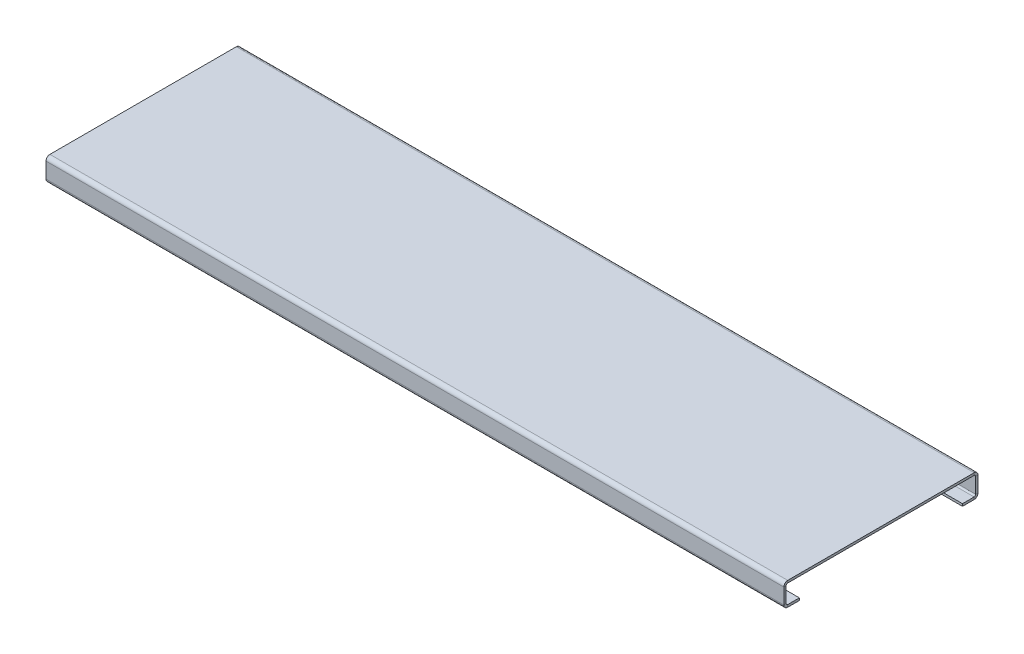
ISO-10303-21;
HEADER;
FILE_DESCRIPTION(('STEP AP214'),'2;1');
FILE_NAME('part.step','',(''),(''),'','','');
FILE_SCHEMA(('AUTOMOTIVE_DESIGN { 1 0 10303 214 1 1 1 1 }'));
ENDSEC;
DATA;
#1=APPLICATION_CONTEXT('core data for automotive mechanical design processes');
#2=APPLICATION_PROTOCOL_DEFINITION('international standard','automotive_design',2000,#1);
#3=PRODUCT_CONTEXT('',#1,'mechanical');
#4=PRODUCT('Part','Part','',(#3));
#5=PRODUCT_RELATED_PRODUCT_CATEGORY('part','',(#4));
#6=PRODUCT_DEFINITION_FORMATION('','',#4);
#7=PRODUCT_DEFINITION_CONTEXT('part definition',#1,'design');
#8=PRODUCT_DEFINITION('design','',#6,#7);
#9=PRODUCT_DEFINITION_SHAPE('','',#8);
#10=(LENGTH_UNIT() NAMED_UNIT(*) SI_UNIT(.MILLI.,.METRE.));
#11=(NAMED_UNIT(*) PLANE_ANGLE_UNIT() SI_UNIT($,.RADIAN.));
#12=(NAMED_UNIT(*) SI_UNIT($,.STERADIAN.) SOLID_ANGLE_UNIT());
#13=UNCERTAINTY_MEASURE_WITH_UNIT(LENGTH_MEASURE(1.E-05),#10,'distance_accuracy_value','');
#14=(GEOMETRIC_REPRESENTATION_CONTEXT(3) GLOBAL_UNCERTAINTY_ASSIGNED_CONTEXT((#13)) GLOBAL_UNIT_ASSIGNED_CONTEXT((#10,
#11,#12)) REPRESENTATION_CONTEXT('',''));
#15=CARTESIAN_POINT('',(0.,0.,0.));
#16=DIRECTION('',(0.,0.,1.));
#17=DIRECTION('',(1.,0.,0.));
#18=AXIS2_PLACEMENT_3D('',#15,#16,#17);
#19=CARTESIAN_POINT('',(950.,-25.,0.));
#20=DIRECTION('',(1.,0.,0.));
#21=DIRECTION('',(0.,0.,-1.));
#22=AXIS2_PLACEMENT_3D('',#19,#20,#21);
#23=PLANE('',#22);
#24=DIRECTION('',(0.,0.,-1.));
#25=VECTOR('',#24,1.);
#26=CARTESIAN_POINT('',(950.,-25.,0.));
#27=LINE('',#26,#25);
#28=CARTESIAN_POINT('',(950.,-25.,0.));
#29=VERTEX_POINT('',#28);
#30=CARTESIAN_POINT('',(950.,-25.,-3.));
#31=VERTEX_POINT('',#30);
#32=EDGE_CURVE('E11',#29,#31,#27,.T.);
#33=ORIENTED_EDGE('',*,*,#32,.F.);
#34=CARTESIAN_POINT('',(950.,-25.,-5.));
#35=DIRECTION('',(1.,0.,0.));
#36=DIRECTION('',(0.,0.,-1.));
#37=AXIS2_PLACEMENT_3D('',#34,#35,#36);
#38=CIRCLE('',#37,5.);
#39=CARTESIAN_POINT('',(950.,-30.,-5.));
#40=VERTEX_POINT('',#39);
#41=EDGE_CURVE('E364',#40,#29,#38,.F.);
#42=ORIENTED_EDGE('',*,*,#41,.F.);
#43=DIRECTION('',(0.,-1.,0.));
#44=VECTOR('',#43,1.);
#45=CARTESIAN_POINT('',(950.,-27.,-5.));
#46=LINE('',#45,#44);
#47=CARTESIAN_POINT('',(950.,-27.,-5.));
#48=VERTEX_POINT('',#47);
#49=EDGE_CURVE('E43',#48,#40,#46,.T.);
#50=ORIENTED_EDGE('',*,*,#49,.F.);
#51=CARTESIAN_POINT('',(950.,-25.,-5.));
#52=DIRECTION('',(1.,0.,0.));
#53=DIRECTION('',(0.,0.,-1.));
#54=AXIS2_PLACEMENT_3D('',#51,#52,#53);
#55=CIRCLE('',#54,2.);
#56=EDGE_CURVE('E377',#48,#31,#55,.F.);
#57=ORIENTED_EDGE('',*,*,#56,.T.);
#58=EDGE_LOOP('',(#33,#42,#50,#57));
#59=FACE_BOUND('',#58,.T.);
#60=ADVANCED_FACE('F35',(#59),#23,.T.);
#61=CARTESIAN_POINT('',(950.,-27.,-5.));
#62=DIRECTION('',(1.,0.,0.));
#63=DIRECTION('',(0.,0.,-1.));
#64=AXIS2_PLACEMENT_3D('',#61,#62,#63);
#65=PLANE('',#64);
#66=DIRECTION('',(0.,1.,0.));
#67=VECTOR('',#66,1.);
#68=CARTESIAN_POINT('',(950.,0.,0.));
#69=LINE('',#68,#67);
#70=CARTESIAN_POINT('',(950.,-5.,0.));
#71=VERTEX_POINT('',#70);
#72=EDGE_CURVE('E368',#29,#71,#69,.T.);
#73=ORIENTED_EDGE('',*,*,#72,.F.);
#74=ORIENTED_EDGE('',*,*,#32,.T.);
#75=DIRECTION('',(0.,1.,0.));
#76=VECTOR('',#75,1.);
#77=CARTESIAN_POINT('',(950.,0.,-3.));
#78=LINE('',#77,#76);
#79=CARTESIAN_POINT('',(950.,-5.,-3.));
#80=VERTEX_POINT('',#79);
#81=EDGE_CURVE('E379',#31,#80,#78,.T.);
#82=ORIENTED_EDGE('',*,*,#81,.T.);
#83=DIRECTION('',(0.,0.,1.));
#84=VECTOR('',#83,1.);
#85=CARTESIAN_POINT('',(950.,-5.,-3.));
#86=LINE('',#85,#84);
#87=EDGE_CURVE('E338',#80,#71,#86,.T.);
#88=ORIENTED_EDGE('',*,*,#87,.T.);
#89=EDGE_LOOP('',(#73,#74,#82,#88));
#90=FACE_BOUND('',#89,.T.);
#91=ADVANCED_FACE('F448',(#90),#65,.T.);
#92=CARTESIAN_POINT('',(0.,-30.,-5.));
#93=DIRECTION('',(-1.,0.,0.));
#94=DIRECTION('',(0.,0.,1.));
#95=AXIS2_PLACEMENT_3D('',#92,#93,#94);
#96=PLANE('',#95);
#97=DIRECTION('',(0.,1.,0.));
#98=VECTOR('',#97,1.);
#99=CARTESIAN_POINT('',(0.,-30.,-5.));
#100=LINE('',#99,#98);
#101=CARTESIAN_POINT('',(0.,-30.,-5.));
#102=VERTEX_POINT('',#101);
#103=CARTESIAN_POINT('',(0.,-27.,-5.));
#104=VERTEX_POINT('',#103);
#105=EDGE_CURVE('E344',#102,#104,#100,.T.);
#106=ORIENTED_EDGE('',*,*,#105,.F.);
#107=CARTESIAN_POINT('',(0.,-25.,-5.));
#108=DIRECTION('',(1.,0.,0.));
#109=DIRECTION('',(0.,0.,-1.));
#110=AXIS2_PLACEMENT_3D('',#107,#108,#109);
#111=CIRCLE('',#110,5.);
#112=CARTESIAN_POINT('',(0.,-25.,0.));
#113=VERTEX_POINT('',#112);
#114=EDGE_CURVE('E248',#102,#113,#111,.F.);
#115=ORIENTED_EDGE('',*,*,#114,.T.);
#116=DIRECTION('',(0.,0.,1.));
#117=VECTOR('',#116,1.);
#118=CARTESIAN_POINT('',(0.,-25.,-3.));
#119=LINE('',#118,#117);
#120=CARTESIAN_POINT('',(0.,-25.,-3.));
#121=VERTEX_POINT('',#120);
#122=EDGE_CURVE('E342',#121,#113,#119,.T.);
#123=ORIENTED_EDGE('',*,*,#122,.F.);
#124=CARTESIAN_POINT('',(0.,-25.,-5.));
#125=DIRECTION('',(1.,0.,0.));
#126=DIRECTION('',(0.,0.,-1.));
#127=AXIS2_PLACEMENT_3D('',#124,#125,#126);
#128=CIRCLE('',#127,2.);
#129=EDGE_CURVE('E260',#104,#121,#128,.F.);
#130=ORIENTED_EDGE('',*,*,#129,.F.);
#131=EDGE_LOOP('',(#106,#115,#123,#130));
#132=FACE_BOUND('',#131,.T.);
#133=ADVANCED_FACE('F490',(#132),#96,.T.);
#134=CARTESIAN_POINT('',(0.,-25.,-3.));
#135=DIRECTION('',(-1.,0.,0.));
#136=DIRECTION('',(0.,0.,1.));
#137=AXIS2_PLACEMENT_3D('',#134,#135,#136);
#138=PLANE('',#137);
#139=DIRECTION('',(0.,0.,1.));
#140=VECTOR('',#139,1.);
#141=CARTESIAN_POINT('',(0.,-30.,0.));
#142=LINE('',#141,#140);
#143=CARTESIAN_POINT('',(0.,-30.,-20.));
#144=VERTEX_POINT('',#143);
#145=EDGE_CURVE('E251',#144,#102,#142,.T.);
#146=ORIENTED_EDGE('',*,*,#145,.T.);
#147=ORIENTED_EDGE('',*,*,#105,.T.);
#148=DIRECTION('',(0.,0.,-1.));
#149=VECTOR('',#148,1.);
#150=CARTESIAN_POINT('',(0.,-27.,0.));
#151=LINE('',#150,#149);
#152=CARTESIAN_POINT('',(0.,-27.,-20.));
#153=VERTEX_POINT('',#152);
#154=EDGE_CURVE('E257',#153,#104,#151,.F.);
#155=ORIENTED_EDGE('',*,*,#154,.F.);
#156=DIRECTION('',(0.,-1.,0.));
#157=VECTOR('',#156,1.);
#158=CARTESIAN_POINT('',(0.,-27.,-20.));
#159=LINE('',#158,#157);
#160=EDGE_CURVE('E254',#153,#144,#159,.T.);
#161=ORIENTED_EDGE('',*,*,#160,.T.);
#162=EDGE_LOOP('',(#146,#147,#155,#161));
#163=FACE_BOUND('',#162,.T.);
#164=ADVANCED_FACE('F494',(#163),#138,.T.);
#165=CARTESIAN_POINT('',(950.,0.,-5.));
#166=DIRECTION('',(1.,0.,0.));
#167=DIRECTION('',(0.,0.,-1.));
#168=AXIS2_PLACEMENT_3D('',#165,#166,#167);
#169=PLANE('',#168);
#170=DIRECTION('',(0.,-1.,0.));
#171=VECTOR('',#170,1.);
#172=CARTESIAN_POINT('',(950.,0.,-5.));
#173=LINE('',#172,#171);
#174=CARTESIAN_POINT('',(950.,0.,-5.));
#175=VERTEX_POINT('',#174);
#176=CARTESIAN_POINT('',(950.,-3.,-5.));
#177=VERTEX_POINT('',#176);
#178=EDGE_CURVE('E340',#175,#177,#173,.T.);
#179=ORIENTED_EDGE('',*,*,#178,.F.);
#180=CARTESIAN_POINT('',(950.,-5.,-5.));
#181=DIRECTION('',(1.,0.,0.));
#182=DIRECTION('',(0.,0.,-1.));
#183=AXIS2_PLACEMENT_3D('',#180,#181,#182);
#184=CIRCLE('',#183,5.);
#185=EDGE_CURVE('E438',#71,#175,#184,.F.);
#186=ORIENTED_EDGE('',*,*,#185,.F.);
#187=ORIENTED_EDGE('',*,*,#87,.F.);
#188=CARTESIAN_POINT('',(950.,-5.,-5.));
#189=DIRECTION('',(1.,0.,0.));
#190=DIRECTION('',(0.,0.,-1.));
#191=AXIS2_PLACEMENT_3D('',#188,#189,#190);
#192=CIRCLE('',#191,2.);
#193=EDGE_CURVE('E382',#80,#177,#192,.F.);
#194=ORIENTED_EDGE('',*,*,#193,.T.);
#195=EDGE_LOOP('',(#179,#186,#187,#194));
#196=FACE_BOUND('',#195,.T.);
#197=ADVANCED_FACE('F455',(#196),#169,.T.);
#198=CARTESIAN_POINT('',(950.,-5.,-3.));
#199=DIRECTION('',(1.,0.,0.));
#200=DIRECTION('',(0.,0.,-1.));
#201=AXIS2_PLACEMENT_3D('',#198,#199,#200);
#202=PLANE('',#201);
#203=DIRECTION('',(0.,0.,-1.));
#204=VECTOR('',#203,1.);
#205=CARTESIAN_POINT('',(950.,0.,0.));
#206=LINE('',#205,#204);
#207=CARTESIAN_POINT('',(950.,0.,-245.));
#208=VERTEX_POINT('',#207);
#209=EDGE_CURVE('E435',#175,#208,#206,.T.);
#210=ORIENTED_EDGE('',*,*,#209,.F.);
#211=ORIENTED_EDGE('',*,*,#178,.T.);
#212=DIRECTION('',(0.,0.,-1.));
#213=VECTOR('',#212,1.);
#214=CARTESIAN_POINT('',(950.,-3.,0.));
#215=LINE('',#214,#213);
#216=CARTESIAN_POINT('',(950.,-3.,-245.));
#217=VERTEX_POINT('',#216);
#218=EDGE_CURVE('E202',#177,#217,#215,.T.);
#219=ORIENTED_EDGE('',*,*,#218,.T.);
#220=DIRECTION('',(0.,1.,0.));
#221=VECTOR('',#220,1.);
#222=CARTESIAN_POINT('',(950.,-3.,-245.));
#223=LINE('',#222,#221);
#224=EDGE_CURVE('E193',#217,#208,#223,.T.);
#225=ORIENTED_EDGE('',*,*,#224,.T.);
#226=EDGE_LOOP('',(#210,#211,#219,#225));
#227=FACE_BOUND('',#226,.T.);
#228=ADVANCED_FACE('F388',(#227),#202,.T.);
#229=CARTESIAN_POINT('',(0.,-5.,0.));
#230=DIRECTION('',(-1.,0.,0.));
#231=DIRECTION('',(0.,0.,1.));
#232=AXIS2_PLACEMENT_3D('',#229,#230,#231);
#233=PLANE('',#232);
#234=DIRECTION('',(0.,0.,-1.));
#235=VECTOR('',#234,1.);
#236=CARTESIAN_POINT('',(0.,-5.,0.));
#237=LINE('',#236,#235);
#238=CARTESIAN_POINT('',(0.,-5.,0.));
#239=VERTEX_POINT('',#238);
#240=CARTESIAN_POINT('',(0.,-5.,-3.));
#241=VERTEX_POINT('',#240);
#242=EDGE_CURVE('E336',#239,#241,#237,.T.);
#243=ORIENTED_EDGE('',*,*,#242,.F.);
#244=CARTESIAN_POINT('',(0.,-5.,-5.));
#245=DIRECTION('',(1.,0.,0.));
#246=DIRECTION('',(0.,0.,-1.));
#247=AXIS2_PLACEMENT_3D('',#244,#245,#246);
#248=CIRCLE('',#247,5.);
#249=CARTESIAN_POINT('',(0.,0.,-5.));
#250=VERTEX_POINT('',#249);
#251=EDGE_CURVE('E242',#239,#250,#248,.F.);
#252=ORIENTED_EDGE('',*,*,#251,.T.);
#253=DIRECTION('',(0.,1.,0.));
#254=VECTOR('',#253,1.);
#255=CARTESIAN_POINT('',(0.,-3.,-5.));
#256=LINE('',#255,#254);
#257=CARTESIAN_POINT('',(0.,-3.,-5.));
#258=VERTEX_POINT('',#257);
#259=EDGE_CURVE('E192',#258,#250,#256,.T.);
#260=ORIENTED_EDGE('',*,*,#259,.F.);
#261=CARTESIAN_POINT('',(0.,-5.,-5.));
#262=DIRECTION('',(1.,0.,0.));
#263=DIRECTION('',(0.,0.,-1.));
#264=AXIS2_PLACEMENT_3D('',#261,#262,#263);
#265=CIRCLE('',#264,2.);
#266=EDGE_CURVE('E266',#241,#258,#265,.F.);
#267=ORIENTED_EDGE('',*,*,#266,.F.);
#268=EDGE_LOOP('',(#243,#252,#260,#267));
#269=FACE_BOUND('',#268,.T.);
#270=ADVANCED_FACE('F464',(#269),#233,.T.);
#271=CARTESIAN_POINT('',(0.,-3.,-5.));
#272=DIRECTION('',(-1.,0.,0.));
#273=DIRECTION('',(0.,0.,1.));
#274=AXIS2_PLACEMENT_3D('',#271,#272,#273);
#275=PLANE('',#274);
#276=DIRECTION('',(0.,1.,0.));
#277=VECTOR('',#276,1.);
#278=CARTESIAN_POINT('',(0.,0.,0.));
#279=LINE('',#278,#277);
#280=EDGE_CURVE('E245',#113,#239,#279,.T.);
#281=ORIENTED_EDGE('',*,*,#280,.T.);
#282=ORIENTED_EDGE('',*,*,#242,.T.);
#283=DIRECTION('',(0.,1.,0.));
#284=VECTOR('',#283,1.);
#285=CARTESIAN_POINT('',(0.,0.,-3.));
#286=LINE('',#285,#284);
#287=EDGE_CURVE('E263',#121,#241,#286,.T.);
#288=ORIENTED_EDGE('',*,*,#287,.F.);
#289=ORIENTED_EDGE('',*,*,#122,.T.);
#290=EDGE_LOOP('',(#281,#282,#288,#289));
#291=FACE_BOUND('',#290,.T.);
#292=ADVANCED_FACE('F468',(#291),#275,.T.);
#293=CARTESIAN_POINT('',(950.,-5.,-250.));
#294=DIRECTION('',(1.,0.,0.));
#295=DIRECTION('',(0.,0.,-1.));
#296=AXIS2_PLACEMENT_3D('',#293,#294,#295);
#297=PLANE('',#296);
#298=DIRECTION('',(0.,0.,1.));
#299=VECTOR('',#298,1.);
#300=CARTESIAN_POINT('',(950.,-5.,-250.));
#301=LINE('',#300,#299);
#302=CARTESIAN_POINT('',(950.,-5.,-250.));
#303=VERTEX_POINT('',#302);
#304=CARTESIAN_POINT('',(950.,-5.,-247.));
#305=VERTEX_POINT('',#304);
#306=EDGE_CURVE('E180',#303,#305,#301,.T.);
#307=ORIENTED_EDGE('',*,*,#306,.F.);
#308=CARTESIAN_POINT('',(950.,-5.,-245.));
#309=DIRECTION('',(1.,0.,0.));
#310=DIRECTION('',(0.,0.,-1.));
#311=AXIS2_PLACEMENT_3D('',#308,#309,#310);
#312=CIRCLE('',#311,5.);
#313=EDGE_CURVE('E400',#208,#303,#312,.F.);
#314=ORIENTED_EDGE('',*,*,#313,.F.);
#315=ORIENTED_EDGE('',*,*,#224,.F.);
#316=CARTESIAN_POINT('',(950.,-5.,-245.));
#317=DIRECTION('',(1.,0.,0.));
#318=DIRECTION('',(0.,0.,-1.));
#319=AXIS2_PLACEMENT_3D('',#316,#317,#318);
#320=CIRCLE('',#319,2.);
#321=EDGE_CURVE('E196',#217,#305,#320,.F.);
#322=ORIENTED_EDGE('',*,*,#321,.T.);
#323=EDGE_LOOP('',(#307,#314,#315,#322));
#324=FACE_BOUND('',#323,.T.);
#325=ADVANCED_FACE('F198',(#324),#297,.T.);
#326=CARTESIAN_POINT('',(950.,-3.,-245.));
#327=DIRECTION('',(1.,0.,0.));
#328=DIRECTION('',(0.,0.,-1.));
#329=AXIS2_PLACEMENT_3D('',#326,#327,#328);
#330=PLANE('',#329);
#331=DIRECTION('',(0.,-1.,0.));
#332=VECTOR('',#331,1.);
#333=CARTESIAN_POINT('',(950.,0.,-250.));
#334=LINE('',#333,#332);
#335=CARTESIAN_POINT('',(950.,-25.,-250.));
#336=VERTEX_POINT('',#335);
#337=EDGE_CURVE('E187',#303,#336,#334,.T.);
#338=ORIENTED_EDGE('',*,*,#337,.F.);
#339=ORIENTED_EDGE('',*,*,#306,.T.);
#340=DIRECTION('',(0.,1.,0.));
#341=VECTOR('',#340,1.);
#342=CARTESIAN_POINT('',(950.,0.,-247.));
#343=LINE('',#342,#341);
#344=CARTESIAN_POINT('',(950.,-25.,-247.));
#345=VERTEX_POINT('',#344);
#346=EDGE_CURVE('E184',#305,#345,#343,.F.);
#347=ORIENTED_EDGE('',*,*,#346,.T.);
#348=DIRECTION('',(0.,0.,-1.));
#349=VECTOR('',#348,1.);
#350=CARTESIAN_POINT('',(950.,-25.,-247.));
#351=LINE('',#350,#349);
#352=EDGE_CURVE('E327',#345,#336,#351,.T.);
#353=ORIENTED_EDGE('',*,*,#352,.T.);
#354=EDGE_LOOP('',(#338,#339,#347,#353));
#355=FACE_BOUND('',#354,.T.);
#356=ADVANCED_FACE('F182',(#355),#330,.T.);
#357=CARTESIAN_POINT('',(0.,0.,-245.));
#358=DIRECTION('',(-1.,0.,0.));
#359=DIRECTION('',(0.,0.,1.));
#360=AXIS2_PLACEMENT_3D('',#357,#358,#359);
#361=PLANE('',#360);
#362=DIRECTION('',(0.,-1.,0.));
#363=VECTOR('',#362,1.);
#364=CARTESIAN_POINT('',(0.,0.,-245.));
#365=LINE('',#364,#363);
#366=CARTESIAN_POINT('',(0.,0.,-245.));
#367=VERTEX_POINT('',#366);
#368=CARTESIAN_POINT('',(0.,-3.,-245.));
#369=VERTEX_POINT('',#368);
#370=EDGE_CURVE('E332',#367,#369,#365,.T.);
#371=ORIENTED_EDGE('',*,*,#370,.F.);
#372=CARTESIAN_POINT('',(0.,-5.,-245.));
#373=DIRECTION('',(1.,0.,0.));
#374=DIRECTION('',(0.,0.,-1.));
#375=AXIS2_PLACEMENT_3D('',#372,#373,#374);
#376=CIRCLE('',#375,5.);
#377=CARTESIAN_POINT('',(0.,-5.,-250.));
#378=VERTEX_POINT('',#377);
#379=EDGE_CURVE('E236',#367,#378,#376,.F.);
#380=ORIENTED_EDGE('',*,*,#379,.T.);
#381=DIRECTION('',(0.,0.,-1.));
#382=VECTOR('',#381,1.);
#383=CARTESIAN_POINT('',(0.,-5.,-247.));
#384=LINE('',#383,#382);
#385=CARTESIAN_POINT('',(0.,-5.,-247.));
#386=VERTEX_POINT('',#385);
#387=EDGE_CURVE('E330',#386,#378,#384,.T.);
#388=ORIENTED_EDGE('',*,*,#387,.F.);
#389=CARTESIAN_POINT('',(0.,-5.,-245.));
#390=DIRECTION('',(1.,0.,0.));
#391=DIRECTION('',(0.,0.,-1.));
#392=AXIS2_PLACEMENT_3D('',#389,#390,#391);
#393=CIRCLE('',#392,2.);
#394=EDGE_CURVE('E209',#369,#386,#393,.F.);
#395=ORIENTED_EDGE('',*,*,#394,.F.);
#396=EDGE_LOOP('',(#371,#380,#388,#395));
#397=FACE_BOUND('',#396,.T.);
#398=ADVANCED_FACE('F394',(#397),#361,.T.);
#399=CARTESIAN_POINT('',(0.,-5.,-247.));
#400=DIRECTION('',(-1.,0.,0.));
#401=DIRECTION('',(0.,0.,1.));
#402=AXIS2_PLACEMENT_3D('',#399,#400,#401);
#403=PLANE('',#402);
#404=DIRECTION('',(0.,0.,-1.));
#405=VECTOR('',#404,1.);
#406=CARTESIAN_POINT('',(0.,0.,0.));
#407=LINE('',#406,#405);
#408=EDGE_CURVE('E239',#250,#367,#407,.T.);
#409=ORIENTED_EDGE('',*,*,#408,.T.);
#410=ORIENTED_EDGE('',*,*,#370,.T.);
#411=DIRECTION('',(0.,0.,-1.));
#412=VECTOR('',#411,1.);
#413=CARTESIAN_POINT('',(0.,-3.,0.));
#414=LINE('',#413,#412);
#415=EDGE_CURVE('E269',#258,#369,#414,.T.);
#416=ORIENTED_EDGE('',*,*,#415,.F.);
#417=ORIENTED_EDGE('',*,*,#259,.T.);
#418=EDGE_LOOP('',(#409,#410,#416,#417));
#419=FACE_BOUND('',#418,.T.);
#420=ADVANCED_FACE('F474',(#419),#403,.T.);
#421=CARTESIAN_POINT('',(950.,-30.,-245.));
#422=DIRECTION('',(1.,0.,0.));
#423=DIRECTION('',(0.,0.,-1.));
#424=AXIS2_PLACEMENT_3D('',#421,#422,#423);
#425=PLANE('',#424);
#426=DIRECTION('',(0.,1.,0.));
#427=VECTOR('',#426,1.);
#428=CARTESIAN_POINT('',(950.,-30.,-245.));
#429=LINE('',#428,#427);
#430=CARTESIAN_POINT('',(950.,-30.,-245.));
#431=VERTEX_POINT('',#430);
#432=CARTESIAN_POINT('',(950.,-27.,-245.));
#433=VERTEX_POINT('',#432);
#434=EDGE_CURVE('E51',#431,#433,#429,.T.);
#435=ORIENTED_EDGE('',*,*,#434,.F.);
#436=CARTESIAN_POINT('',(950.,-25.,-245.));
#437=DIRECTION('',(1.,0.,0.));
#438=DIRECTION('',(0.,0.,-1.));
#439=AXIS2_PLACEMENT_3D('',#436,#437,#438);
#440=CIRCLE('',#439,5.);
#441=EDGE_CURVE('E428',#336,#431,#440,.F.);
#442=ORIENTED_EDGE('',*,*,#441,.F.);
#443=ORIENTED_EDGE('',*,*,#352,.F.);
#444=CARTESIAN_POINT('',(950.,-25.,-245.));
#445=DIRECTION('',(1.,0.,0.));
#446=DIRECTION('',(0.,0.,-1.));
#447=AXIS2_PLACEMENT_3D('',#444,#445,#446);
#448=CIRCLE('',#447,2.);
#449=EDGE_CURVE('E217',#345,#433,#448,.F.);
#450=ORIENTED_EDGE('',*,*,#449,.T.);
#451=EDGE_LOOP('',(#435,#442,#443,#450));
#452=FACE_BOUND('',#451,.T.);
#453=ADVANCED_FACE('F476',(#452),#425,.T.);
#454=CARTESIAN_POINT('',(950.,-25.,-247.));
#455=DIRECTION('',(1.,0.,0.));
#456=DIRECTION('',(0.,0.,-1.));
#457=AXIS2_PLACEMENT_3D('',#454,#455,#456);
#458=PLANE('',#457);
#459=DIRECTION('',(0.,0.,1.));
#460=VECTOR('',#459,1.);
#461=CARTESIAN_POINT('',(950.,-30.,-250.));
#462=LINE('',#461,#460);
#463=CARTESIAN_POINT('',(950.,-30.,-230.));
#464=VERTEX_POINT('',#463);
#465=EDGE_CURVE('E426',#431,#464,#462,.T.);
#466=ORIENTED_EDGE('',*,*,#465,.F.);
#467=ORIENTED_EDGE('',*,*,#434,.T.);
#468=DIRECTION('',(0.,0.,1.));
#469=VECTOR('',#468,1.);
#470=CARTESIAN_POINT('',(950.,-27.,-250.));
#471=LINE('',#470,#469);
#472=CARTESIAN_POINT('',(950.,-27.,-230.));
#473=VERTEX_POINT('',#472);
#474=EDGE_CURVE('E129',#433,#473,#471,.T.);
#475=ORIENTED_EDGE('',*,*,#474,.T.);
#476=DIRECTION('',(0.,1.,0.));
#477=VECTOR('',#476,1.);
#478=CARTESIAN_POINT('',(950.,-30.,-230.));
#479=LINE('',#478,#477);
#480=EDGE_CURVE('E424',#464,#473,#479,.T.);
#481=ORIENTED_EDGE('',*,*,#480,.F.);
#482=EDGE_LOOP('',(#466,#467,#475,#481));
#483=FACE_BOUND('',#482,.T.);
#484=ADVANCED_FACE('F482',(#483),#458,.T.);
#485=CARTESIAN_POINT('',(0.,-25.,-250.));
#486=DIRECTION('',(-1.,0.,0.));
#487=DIRECTION('',(0.,0.,1.));
#488=AXIS2_PLACEMENT_3D('',#485,#486,#487);
#489=PLANE('',#488);
#490=DIRECTION('',(0.,0.,1.));
#491=VECTOR('',#490,1.);
#492=CARTESIAN_POINT('',(0.,-25.,-250.));
#493=LINE('',#492,#491);
#494=CARTESIAN_POINT('',(0.,-25.,-250.));
#495=VERTEX_POINT('',#494);
#496=CARTESIAN_POINT('',(0.,-25.,-247.));
#497=VERTEX_POINT('',#496);
#498=EDGE_CURVE('E116',#495,#497,#493,.T.);
#499=ORIENTED_EDGE('',*,*,#498,.F.);
#500=CARTESIAN_POINT('',(0.,-25.,-245.));
#501=DIRECTION('',(1.,0.,0.));
#502=DIRECTION('',(0.,0.,-1.));
#503=AXIS2_PLACEMENT_3D('',#500,#501,#502);
#504=CIRCLE('',#503,5.);
#505=CARTESIAN_POINT('',(0.,-30.,-245.));
#506=VERTEX_POINT('',#505);
#507=EDGE_CURVE('E232',#495,#506,#504,.F.);
#508=ORIENTED_EDGE('',*,*,#507,.T.);
#509=DIRECTION('',(0.,-1.,0.));
#510=VECTOR('',#509,1.);
#511=CARTESIAN_POINT('',(0.,-27.,-245.));
#512=LINE('',#511,#510);
#513=CARTESIAN_POINT('',(0.,-27.,-245.));
#514=VERTEX_POINT('',#513);
#515=EDGE_CURVE('E123',#514,#506,#512,.T.);
#516=ORIENTED_EDGE('',*,*,#515,.F.);
#517=CARTESIAN_POINT('',(0.,-25.,-245.));
#518=DIRECTION('',(1.,0.,0.));
#519=DIRECTION('',(0.,0.,-1.));
#520=AXIS2_PLACEMENT_3D('',#517,#518,#519);
#521=CIRCLE('',#520,2.);
#522=EDGE_CURVE('E275',#497,#514,#521,.F.);
#523=ORIENTED_EDGE('',*,*,#522,.F.);
#524=EDGE_LOOP('',(#499,#508,#516,#523));
#525=FACE_BOUND('',#524,.T.);
#526=ADVANCED_FACE('F411',(#525),#489,.T.);
#527=CARTESIAN_POINT('',(0.,-27.,-245.));
#528=DIRECTION('',(-1.,0.,0.));
#529=DIRECTION('',(0.,0.,1.));
#530=AXIS2_PLACEMENT_3D('',#527,#528,#529);
#531=PLANE('',#530);
#532=DIRECTION('',(0.,-1.,0.));
#533=VECTOR('',#532,1.);
#534=CARTESIAN_POINT('',(0.,0.,-250.));
#535=LINE('',#534,#533);
#536=EDGE_CURVE('E234',#378,#495,#535,.T.);
#537=ORIENTED_EDGE('',*,*,#536,.T.);
#538=ORIENTED_EDGE('',*,*,#498,.T.);
#539=DIRECTION('',(0.,1.,0.));
#540=VECTOR('',#539,1.);
#541=CARTESIAN_POINT('',(0.,0.,-247.));
#542=LINE('',#541,#540);
#543=EDGE_CURVE('E273',#386,#497,#542,.F.);
#544=ORIENTED_EDGE('',*,*,#543,.F.);
#545=ORIENTED_EDGE('',*,*,#387,.T.);
#546=EDGE_LOOP('',(#537,#538,#544,#545));
#547=FACE_BOUND('',#546,.T.);
#548=ADVANCED_FACE('F396',(#547),#531,.T.);
#549=CARTESIAN_POINT('',(950.,-27.,-250.));
#550=DIRECTION('',(0.,-1.,0.));
#551=DIRECTION('',(0.,0.,-1.));
#552=AXIS2_PLACEMENT_3D('',#549,#550,#551);
#553=PLANE('',#552);
#554=DIRECTION('',(0.,0.,1.));
#555=VECTOR('',#554,1.);
#556=CARTESIAN_POINT('',(0.,-27.,-250.));
#557=LINE('',#556,#555);
#558=CARTESIAN_POINT('',(0.,-27.,-230.));
#559=VERTEX_POINT('',#558);
#560=EDGE_CURVE('E223',#514,#559,#557,.T.);
#561=ORIENTED_EDGE('',*,*,#560,.T.);
#562=DIRECTION('',(-1.,0.,0.));
#563=VECTOR('',#562,1.);
#564=CARTESIAN_POINT('',(950.,-27.,-230.));
#565=LINE('',#564,#563);
#566=EDGE_CURVE('E323',#473,#559,#565,.T.);
#567=ORIENTED_EDGE('',*,*,#566,.F.);
#568=ORIENTED_EDGE('',*,*,#474,.F.);
#569=DIRECTION('',(-1.,0.,0.));
#570=VECTOR('',#569,1.);
#571=CARTESIAN_POINT('',(950.,-27.,-245.));
#572=LINE('',#571,#570);
#573=EDGE_CURVE('E219',#433,#514,#572,.T.);
#574=ORIENTED_EDGE('',*,*,#573,.T.);
#575=EDGE_LOOP('',(#561,#567,#568,#574));
#576=FACE_BOUND('',#575,.T.);
#577=ADVANCED_FACE('F417',(#576),#553,.F.);
#578=CARTESIAN_POINT('',(950.,-30.,-230.));
#579=DIRECTION('',(0.,0.,1.));
#580=DIRECTION('',(1.,0.,0.));
#581=AXIS2_PLACEMENT_3D('',#578,#579,#580);
#582=PLANE('',#581);
#583=DIRECTION('',(0.,1.,0.));
#584=VECTOR('',#583,1.);
#585=CARTESIAN_POINT('',(0.,-30.,-230.));
#586=LINE('',#585,#584);
#587=CARTESIAN_POINT('',(0.,-30.,-230.));
#588=VERTEX_POINT('',#587);
#589=EDGE_CURVE('E226',#588,#559,#586,.T.);
#590=ORIENTED_EDGE('',*,*,#589,.F.);
#591=DIRECTION('',(-1.,0.,0.));
#592=VECTOR('',#591,1.);
#593=CARTESIAN_POINT('',(950.,-30.,-230.));
#594=LINE('',#593,#592);
#595=EDGE_CURVE('E321',#464,#588,#594,.T.);
#596=ORIENTED_EDGE('',*,*,#595,.F.);
#597=ORIENTED_EDGE('',*,*,#480,.T.);
#598=ORIENTED_EDGE('',*,*,#566,.T.);
#599=EDGE_LOOP('',(#590,#596,#597,#598));
#600=FACE_BOUND('',#599,.T.);
#601=ADVANCED_FACE('F422',(#600),#582,.T.);
#602=CARTESIAN_POINT('',(950.,-30.,-250.));
#603=DIRECTION('',(0.,-1.,0.));
#604=DIRECTION('',(0.,0.,-1.));
#605=AXIS2_PLACEMENT_3D('',#602,#603,#604);
#606=PLANE('',#605);
#607=DIRECTION('',(0.,0.,1.));
#608=VECTOR('',#607,1.);
#609=CARTESIAN_POINT('',(0.,-30.,-250.));
#610=LINE('',#609,#608);
#611=EDGE_CURVE('E229',#506,#588,#610,.T.);
#612=ORIENTED_EDGE('',*,*,#611,.F.);
#613=DIRECTION('',(-1.,0.,0.));
#614=VECTOR('',#613,1.);
#615=CARTESIAN_POINT('',(950.,-30.,-245.));
#616=LINE('',#615,#614);
#617=EDGE_CURVE('E318',#431,#506,#616,.T.);
#618=ORIENTED_EDGE('',*,*,#617,.F.);
#619=ORIENTED_EDGE('',*,*,#465,.T.);
#620=ORIENTED_EDGE('',*,*,#595,.T.);
#621=EDGE_LOOP('',(#612,#618,#619,#620));
#622=FACE_BOUND('',#621,.T.);
#623=ADVANCED_FACE('F578',(#622),#606,.T.);
#624=CARTESIAN_POINT('',(950.,-25.,-245.));
#625=DIRECTION('',(-1.,0.,0.));
#626=DIRECTION('',(0.,0.,1.));
#627=AXIS2_PLACEMENT_3D('',#624,#625,#626);
#628=CYLINDRICAL_SURFACE('',#627,5.);
#629=ORIENTED_EDGE('',*,*,#507,.F.);
#630=DIRECTION('',(-1.,0.,0.));
#631=VECTOR('',#630,1.);
#632=CARTESIAN_POINT('',(950.,-25.,-250.));
#633=LINE('',#632,#631);
#634=EDGE_CURVE('E315',#336,#495,#633,.T.);
#635=ORIENTED_EDGE('',*,*,#634,.F.);
#636=ORIENTED_EDGE('',*,*,#441,.T.);
#637=ORIENTED_EDGE('',*,*,#617,.T.);
#638=EDGE_LOOP('',(#629,#635,#636,#637));
#639=FACE_BOUND('',#638,.T.);
#640=ADVANCED_FACE('F408',(#639),#628,.T.);
#641=CARTESIAN_POINT('',(950.,0.,-250.));
#642=DIRECTION('',(0.,0.,-1.));
#643=DIRECTION('',(-1.,0.,0.));
#644=AXIS2_PLACEMENT_3D('',#641,#642,#643);
#645=PLANE('',#644);
#646=ORIENTED_EDGE('',*,*,#536,.F.);
#647=DIRECTION('',(-1.,0.,0.));
#648=VECTOR('',#647,1.);
#649=CARTESIAN_POINT('',(950.,-5.,-250.));
#650=LINE('',#649,#648);
#651=EDGE_CURVE('E312',#303,#378,#650,.T.);
#652=ORIENTED_EDGE('',*,*,#651,.F.);
#653=ORIENTED_EDGE('',*,*,#337,.T.);
#654=ORIENTED_EDGE('',*,*,#634,.T.);
#655=EDGE_LOOP('',(#646,#652,#653,#654));
#656=FACE_BOUND('',#655,.T.);
#657=ADVANCED_FACE('F402',(#656),#645,.T.);
#658=CARTESIAN_POINT('',(950.,-5.,-245.));
#659=DIRECTION('',(-1.,0.,0.));
#660=DIRECTION('',(0.,0.,1.));
#661=AXIS2_PLACEMENT_3D('',#658,#659,#660);
#662=CYLINDRICAL_SURFACE('',#661,5.);
#663=ORIENTED_EDGE('',*,*,#379,.F.);
#664=DIRECTION('',(-1.,0.,0.));
#665=VECTOR('',#664,1.);
#666=CARTESIAN_POINT('',(950.,0.,-245.));
#667=LINE('',#666,#665);
#668=EDGE_CURVE('E309',#208,#367,#667,.T.);
#669=ORIENTED_EDGE('',*,*,#668,.F.);
#670=ORIENTED_EDGE('',*,*,#313,.T.);
#671=ORIENTED_EDGE('',*,*,#651,.T.);
#672=EDGE_LOOP('',(#663,#669,#670,#671));
#673=FACE_BOUND('',#672,.T.);
#674=ADVANCED_FACE('F399',(#673),#662,.T.);
#675=CARTESIAN_POINT('',(950.,0.,0.));
#676=DIRECTION('',(0.,1.,0.));
#677=DIRECTION('',(0.,0.,1.));
#678=AXIS2_PLACEMENT_3D('',#675,#676,#677);
#679=PLANE('',#678);
#680=ORIENTED_EDGE('',*,*,#408,.F.);
#681=DIRECTION('',(-1.,0.,0.));
#682=VECTOR('',#681,1.);
#683=CARTESIAN_POINT('',(950.,0.,-5.));
#684=LINE('',#683,#682);
#685=EDGE_CURVE('E306',#175,#250,#684,.T.);
#686=ORIENTED_EDGE('',*,*,#685,.F.);
#687=ORIENTED_EDGE('',*,*,#209,.T.);
#688=ORIENTED_EDGE('',*,*,#668,.T.);
#689=EDGE_LOOP('',(#680,#686,#687,#688));
#690=FACE_BOUND('',#689,.T.);
#691=ADVANCED_FACE('F461',(#690),#679,.T.);
#692=CARTESIAN_POINT('',(950.,-5.,-5.));
#693=DIRECTION('',(-1.,0.,0.));
#694=DIRECTION('',(0.,0.,1.));
#695=AXIS2_PLACEMENT_3D('',#692,#693,#694);
#696=CYLINDRICAL_SURFACE('',#695,5.);
#697=ORIENTED_EDGE('',*,*,#251,.F.);
#698=DIRECTION('',(-1.,0.,0.));
#699=VECTOR('',#698,1.);
#700=CARTESIAN_POINT('',(950.,-5.,0.));
#701=LINE('',#700,#699);
#702=EDGE_CURVE('E303',#71,#239,#701,.T.);
#703=ORIENTED_EDGE('',*,*,#702,.F.);
#704=ORIENTED_EDGE('',*,*,#185,.T.);
#705=ORIENTED_EDGE('',*,*,#685,.T.);
#706=EDGE_LOOP('',(#697,#703,#704,#705));
#707=FACE_BOUND('',#706,.T.);
#708=ADVANCED_FACE('F454',(#707),#696,.T.);
#709=CARTESIAN_POINT('',(950.,0.,0.));
#710=DIRECTION('',(0.,0.,1.));
#711=DIRECTION('',(0.,-1.,0.));
#712=AXIS2_PLACEMENT_3D('',#709,#710,#711);
#713=PLANE('',#712);
#714=ORIENTED_EDGE('',*,*,#280,.F.);
#715=DIRECTION('',(-1.,0.,0.));
#716=VECTOR('',#715,1.);
#717=CARTESIAN_POINT('',(950.,-25.,0.));
#718=LINE('',#717,#716);
#719=EDGE_CURVE('E300',#29,#113,#718,.T.);
#720=ORIENTED_EDGE('',*,*,#719,.F.);
#721=ORIENTED_EDGE('',*,*,#72,.T.);
#722=ORIENTED_EDGE('',*,*,#702,.T.);
#723=EDGE_LOOP('',(#714,#720,#721,#722));
#724=FACE_BOUND('',#723,.T.);
#725=ADVANCED_FACE('F444',(#724),#713,.T.);
#726=CARTESIAN_POINT('',(950.,-25.,-5.));
#727=DIRECTION('',(-1.,0.,0.));
#728=DIRECTION('',(0.,0.,1.));
#729=AXIS2_PLACEMENT_3D('',#726,#727,#728);
#730=CYLINDRICAL_SURFACE('',#729,5.);
#731=ORIENTED_EDGE('',*,*,#114,.F.);
#732=DIRECTION('',(-1.,0.,0.));
#733=VECTOR('',#732,1.);
#734=CARTESIAN_POINT('',(950.,-30.,-5.));
#735=LINE('',#734,#733);
#736=EDGE_CURVE('E297',#40,#102,#735,.T.);
#737=ORIENTED_EDGE('',*,*,#736,.F.);
#738=ORIENTED_EDGE('',*,*,#41,.T.);
#739=ORIENTED_EDGE('',*,*,#719,.T.);
#740=EDGE_LOOP('',(#731,#737,#738,#739));
#741=FACE_BOUND('',#740,.T.);
#742=ADVANCED_FACE('F363',(#741),#730,.T.);
#743=CARTESIAN_POINT('',(950.,-30.,0.));
#744=DIRECTION('',(0.,-1.,0.));
#745=DIRECTION('',(0.,0.,-1.));
#746=AXIS2_PLACEMENT_3D('',#743,#744,#745);
#747=PLANE('',#746);
#748=ORIENTED_EDGE('',*,*,#145,.F.);
#749=DIRECTION('',(-1.,0.,0.));
#750=VECTOR('',#749,1.);
#751=CARTESIAN_POINT('',(950.,-30.,-20.));
#752=LINE('',#751,#750);
#753=CARTESIAN_POINT('',(950.,-30.,-20.));
#754=VERTEX_POINT('',#753);
#755=EDGE_CURVE('E295',#754,#144,#752,.T.);
#756=ORIENTED_EDGE('',*,*,#755,.F.);
#757=DIRECTION('',(0.,0.,1.));
#758=VECTOR('',#757,1.);
#759=CARTESIAN_POINT('',(950.,-30.,0.));
#760=LINE('',#759,#758);
#761=EDGE_CURVE('E352',#754,#40,#760,.T.);
#762=ORIENTED_EDGE('',*,*,#761,.T.);
#763=ORIENTED_EDGE('',*,*,#736,.T.);
#764=EDGE_LOOP('',(#748,#756,#762,#763));
#765=FACE_BOUND('',#764,.T.);
#766=ADVANCED_FACE('F370',(#765),#747,.T.);
#767=CARTESIAN_POINT('',(950.,-27.,-20.));
#768=DIRECTION('',(0.,0.,-1.));
#769=DIRECTION('',(-1.,0.,0.));
#770=AXIS2_PLACEMENT_3D('',#767,#768,#769);
#771=PLANE('',#770);
#772=ORIENTED_EDGE('',*,*,#160,.F.);
#773=DIRECTION('',(-1.,0.,0.));
#774=VECTOR('',#773,1.);
#775=CARTESIAN_POINT('',(950.,-27.,-20.));
#776=LINE('',#775,#774);
#777=CARTESIAN_POINT('',(950.,-27.,-20.));
#778=VERTEX_POINT('',#777);
#779=EDGE_CURVE('E293',#778,#153,#776,.T.);
#780=ORIENTED_EDGE('',*,*,#779,.F.);
#781=DIRECTION('',(0.,-1.,0.));
#782=VECTOR('',#781,1.);
#783=CARTESIAN_POINT('',(950.,-27.,-20.));
#784=LINE('',#783,#782);
#785=EDGE_CURVE('E371',#778,#754,#784,.T.);
#786=ORIENTED_EDGE('',*,*,#785,.T.);
#787=ORIENTED_EDGE('',*,*,#755,.T.);
#788=EDGE_LOOP('',(#772,#780,#786,#787));
#789=FACE_BOUND('',#788,.T.);
#790=ADVANCED_FACE('F661',(#789),#771,.T.);
#791=CARTESIAN_POINT('',(950.,-27.,0.));
#792=DIRECTION('',(0.,-1.,0.));
#793=DIRECTION('',(0.,0.,-1.));
#794=AXIS2_PLACEMENT_3D('',#791,#792,#793);
#795=PLANE('',#794);
#796=ORIENTED_EDGE('',*,*,#154,.T.);
#797=DIRECTION('',(-1.,0.,0.));
#798=VECTOR('',#797,1.);
#799=CARTESIAN_POINT('',(950.,-27.,-5.));
#800=LINE('',#799,#798);
#801=EDGE_CURVE('E290',#48,#104,#800,.T.);
#802=ORIENTED_EDGE('',*,*,#801,.F.);
#803=DIRECTION('',(0.,0.,-1.));
#804=VECTOR('',#803,1.);
#805=CARTESIAN_POINT('',(950.,-27.,0.));
#806=LINE('',#805,#804);
#807=EDGE_CURVE('E355',#778,#48,#806,.F.);
#808=ORIENTED_EDGE('',*,*,#807,.F.);
#809=ORIENTED_EDGE('',*,*,#779,.T.);
#810=EDGE_LOOP('',(#796,#802,#808,#809));
#811=FACE_BOUND('',#810,.T.);
#812=ADVANCED_FACE('F671',(#811),#795,.F.);
#813=CARTESIAN_POINT('',(950.,-25.,-5.));
#814=DIRECTION('',(-1.,0.,0.));
#815=DIRECTION('',(0.,0.,1.));
#816=AXIS2_PLACEMENT_3D('',#813,#814,#815);
#817=CYLINDRICAL_SURFACE('',#816,2.);
#818=ORIENTED_EDGE('',*,*,#129,.T.);
#819=DIRECTION('',(-1.,0.,0.));
#820=VECTOR('',#819,1.);
#821=CARTESIAN_POINT('',(950.,-25.,-3.));
#822=LINE('',#821,#820);
#823=EDGE_CURVE('E287',#31,#121,#822,.T.);
#824=ORIENTED_EDGE('',*,*,#823,.F.);
#825=ORIENTED_EDGE('',*,*,#56,.F.);
#826=ORIENTED_EDGE('',*,*,#801,.T.);
#827=EDGE_LOOP('',(#818,#824,#825,#826));
#828=FACE_BOUND('',#827,.T.);
#829=ADVANCED_FACE('F682',(#828),#817,.F.);
#830=CARTESIAN_POINT('',(950.,0.,-3.));
#831=DIRECTION('',(0.,0.,1.));
#832=DIRECTION('',(0.,-1.,0.));
#833=AXIS2_PLACEMENT_3D('',#830,#831,#832);
#834=PLANE('',#833);
#835=ORIENTED_EDGE('',*,*,#287,.T.);
#836=DIRECTION('',(-1.,0.,0.));
#837=VECTOR('',#836,1.);
#838=CARTESIAN_POINT('',(950.,-5.,-3.));
#839=LINE('',#838,#837);
#840=EDGE_CURVE('E284',#80,#241,#839,.T.);
#841=ORIENTED_EDGE('',*,*,#840,.F.);
#842=ORIENTED_EDGE('',*,*,#81,.F.);
#843=ORIENTED_EDGE('',*,*,#823,.T.);
#844=EDGE_LOOP('',(#835,#841,#842,#843));
#845=FACE_BOUND('',#844,.T.);
#846=ADVANCED_FACE('F470',(#845),#834,.F.);
#847=CARTESIAN_POINT('',(950.,-5.,-5.));
#848=DIRECTION('',(-1.,0.,0.));
#849=DIRECTION('',(0.,0.,1.));
#850=AXIS2_PLACEMENT_3D('',#847,#848,#849);
#851=CYLINDRICAL_SURFACE('',#850,2.);
#852=ORIENTED_EDGE('',*,*,#266,.T.);
#853=DIRECTION('',(-1.,0.,0.));
#854=VECTOR('',#853,1.);
#855=CARTESIAN_POINT('',(950.,-3.,-5.));
#856=LINE('',#855,#854);
#857=EDGE_CURVE('E281',#177,#258,#856,.T.);
#858=ORIENTED_EDGE('',*,*,#857,.F.);
#859=ORIENTED_EDGE('',*,*,#193,.F.);
#860=ORIENTED_EDGE('',*,*,#840,.T.);
#861=EDGE_LOOP('',(#852,#858,#859,#860));
#862=FACE_BOUND('',#861,.T.);
#863=ADVANCED_FACE('F473',(#862),#851,.F.);
#864=CARTESIAN_POINT('',(950.,-3.,0.));
#865=DIRECTION('',(0.,1.,0.));
#866=DIRECTION('',(0.,0.,1.));
#867=AXIS2_PLACEMENT_3D('',#864,#865,#866);
#868=PLANE('',#867);
#869=ORIENTED_EDGE('',*,*,#415,.T.);
#870=DIRECTION('',(-1.,0.,0.));
#871=VECTOR('',#870,1.);
#872=CARTESIAN_POINT('',(950.,-3.,-245.));
#873=LINE('',#872,#871);
#874=EDGE_CURVE('E211',#217,#369,#873,.T.);
#875=ORIENTED_EDGE('',*,*,#874,.F.);
#876=ORIENTED_EDGE('',*,*,#218,.F.);
#877=ORIENTED_EDGE('',*,*,#857,.T.);
#878=EDGE_LOOP('',(#869,#875,#876,#877));
#879=FACE_BOUND('',#878,.T.);
#880=ADVANCED_FACE('F391',(#879),#868,.F.);
#881=CARTESIAN_POINT('',(950.,-5.,-245.));
#882=DIRECTION('',(-1.,0.,0.));
#883=DIRECTION('',(0.,0.,1.));
#884=AXIS2_PLACEMENT_3D('',#881,#882,#883);
#885=CYLINDRICAL_SURFACE('',#884,2.);
#886=ORIENTED_EDGE('',*,*,#394,.T.);
#887=DIRECTION('',(-1.,0.,0.));
#888=VECTOR('',#887,1.);
#889=CARTESIAN_POINT('',(950.,-5.,-247.));
#890=LINE('',#889,#888);
#891=EDGE_CURVE('E206',#305,#386,#890,.T.);
#892=ORIENTED_EDGE('',*,*,#891,.F.);
#893=ORIENTED_EDGE('',*,*,#321,.F.);
#894=ORIENTED_EDGE('',*,*,#874,.T.);
#895=EDGE_LOOP('',(#886,#892,#893,#894));
#896=FACE_BOUND('',#895,.T.);
#897=ADVANCED_FACE('F207',(#896),#885,.F.);
#898=CARTESIAN_POINT('',(950.,0.,-247.));
#899=DIRECTION('',(0.,0.,-1.));
#900=DIRECTION('',(-1.,0.,0.));
#901=AXIS2_PLACEMENT_3D('',#898,#899,#900);
#902=PLANE('',#901);
#903=ORIENTED_EDGE('',*,*,#543,.T.);
#904=DIRECTION('',(-1.,0.,0.));
#905=VECTOR('',#904,1.);
#906=CARTESIAN_POINT('',(950.,-25.,-247.));
#907=LINE('',#906,#905);
#908=EDGE_CURVE('E212',#345,#497,#907,.T.);
#909=ORIENTED_EDGE('',*,*,#908,.F.);
#910=ORIENTED_EDGE('',*,*,#346,.F.);
#911=ORIENTED_EDGE('',*,*,#891,.T.);
#912=EDGE_LOOP('',(#903,#909,#910,#911));
#913=FACE_BOUND('',#912,.T.);
#914=ADVANCED_FACE('F214',(#913),#902,.F.);
#915=CARTESIAN_POINT('',(950.,-25.,-245.));
#916=DIRECTION('',(-1.,0.,0.));
#917=DIRECTION('',(0.,0.,1.));
#918=AXIS2_PLACEMENT_3D('',#915,#916,#917);
#919=CYLINDRICAL_SURFACE('',#918,2.);
#920=ORIENTED_EDGE('',*,*,#522,.T.);
#921=ORIENTED_EDGE('',*,*,#573,.F.);
#922=ORIENTED_EDGE('',*,*,#449,.F.);
#923=ORIENTED_EDGE('',*,*,#908,.T.);
#924=EDGE_LOOP('',(#920,#921,#922,#923));
#925=FACE_BOUND('',#924,.T.);
#926=ADVANCED_FACE('F414',(#925),#919,.F.);
#927=CARTESIAN_POINT('',(950.,-25.,-245.));
#928=DIRECTION('',(1.,0.,0.));
#929=DIRECTION('',(0.,0.,-1.));
#930=AXIS2_PLACEMENT_3D('',#927,#928,#929);
#931=PLANE('',#930);
#932=ORIENTED_EDGE('',*,*,#807,.T.);
#933=ORIENTED_EDGE('',*,*,#49,.T.);
#934=ORIENTED_EDGE('',*,*,#761,.F.);
#935=ORIENTED_EDGE('',*,*,#785,.F.);
#936=EDGE_LOOP('',(#932,#933,#934,#935));
#937=FACE_BOUND('',#936,.T.);
#938=ADVANCED_FACE('F349',(#937),#931,.T.);
#939=CARTESIAN_POINT('',(0.,-25.,-245.));
#940=DIRECTION('',(1.,0.,0.));
#941=DIRECTION('',(0.,0.,-1.));
#942=AXIS2_PLACEMENT_3D('',#939,#940,#941);
#943=PLANE('',#942);
#944=ORIENTED_EDGE('',*,*,#560,.F.);
#945=ORIENTED_EDGE('',*,*,#515,.T.);
#946=ORIENTED_EDGE('',*,*,#611,.T.);
#947=ORIENTED_EDGE('',*,*,#589,.T.);
#948=EDGE_LOOP('',(#944,#945,#946,#947));
#949=FACE_BOUND('',#948,.T.);
#950=ADVANCED_FACE('F419',(#949),#943,.F.);
#951=CLOSED_SHELL('',(#60,#91,#133,#164,#197,#228,#270,#292,#325,#356,#398,#420,#453,#484,#526,
#548,#577,#601,#623,#640,#657,#674,#691,#708,#725,#742,#766,#790,#812,#829,#846,#863,#880,#897,
#914,#926,#938,#950));
#952=MANIFOLD_SOLID_BREP('B2',#951);
#953=ADVANCED_BREP_SHAPE_REPRESENTATION('',(#18,#952),#14);
#954=SHAPE_DEFINITION_REPRESENTATION(#9,#953);
ENDSEC;
END-ISO-10303-21;
